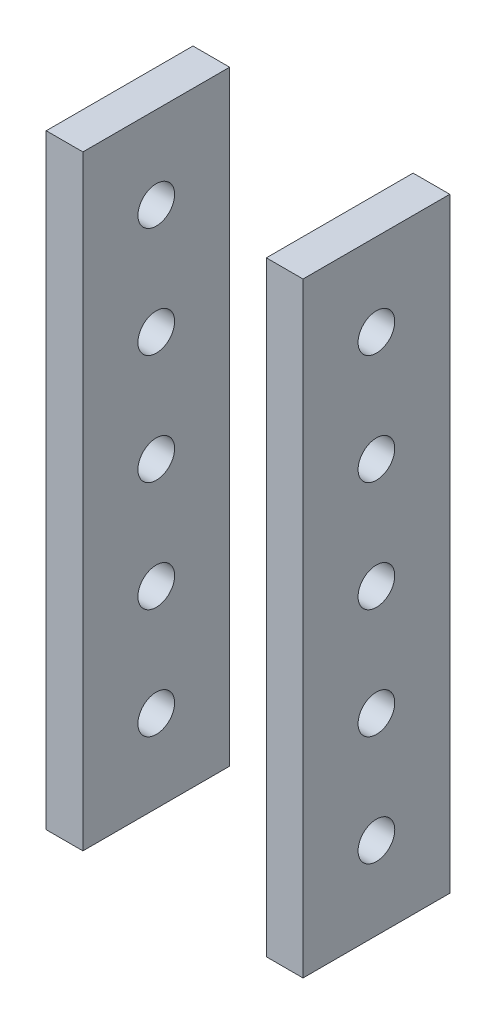
ISO-10303-21;
HEADER;
FILE_DESCRIPTION(('STEP AP214'),'2;1');
FILE_NAME('part.step','',(''),(''),'','','');
FILE_SCHEMA(('AUTOMOTIVE_DESIGN { 1 0 10303 214 1 1 1 1 }'));
ENDSEC;
DATA;
#1=APPLICATION_CONTEXT('core data for automotive mechanical design processes');
#2=APPLICATION_PROTOCOL_DEFINITION('international standard','automotive_design',2000,#1);
#3=PRODUCT_CONTEXT('',#1,'mechanical');
#4=PRODUCT('Part','Part','',(#3));
#5=PRODUCT_RELATED_PRODUCT_CATEGORY('part','',(#4));
#6=PRODUCT_DEFINITION_FORMATION('','',#4);
#7=PRODUCT_DEFINITION_CONTEXT('part definition',#1,'design');
#8=PRODUCT_DEFINITION('design','',#6,#7);
#9=PRODUCT_DEFINITION_SHAPE('','',#8);
#10=(LENGTH_UNIT() NAMED_UNIT(*) SI_UNIT(.MILLI.,.METRE.));
#11=(NAMED_UNIT(*) PLANE_ANGLE_UNIT() SI_UNIT($,.RADIAN.));
#12=(NAMED_UNIT(*) SI_UNIT($,.STERADIAN.) SOLID_ANGLE_UNIT());
#13=UNCERTAINTY_MEASURE_WITH_UNIT(LENGTH_MEASURE(1.E-05),#10,'distance_accuracy_value','');
#14=(GEOMETRIC_REPRESENTATION_CONTEXT(3) GLOBAL_UNCERTAINTY_ASSIGNED_CONTEXT((#13)) GLOBAL_UNIT_ASSIGNED_CONTEXT((#10,
#11,#12)) REPRESENTATION_CONTEXT('',''));
#15=CARTESIAN_POINT('',(0.,0.,0.));
#16=DIRECTION('',(0.,0.,1.));
#17=DIRECTION('',(1.,0.,0.));
#18=AXIS2_PLACEMENT_3D('',#15,#16,#17);
#19=CARTESIAN_POINT('',(35.,0.,0.));
#20=DIRECTION('',(0.,0.,1.));
#21=DIRECTION('',(-1.,0.,0.));
#22=AXIS2_PLACEMENT_3D('',#19,#20,#21);
#23=PLANE('',#22);
#24=DIRECTION('',(0.,-1.,0.));
#25=VECTOR('',#24,1.);
#26=CARTESIAN_POINT('',(25.,0.,0.));
#27=LINE('',#26,#25);
#28=CARTESIAN_POINT('',(25.,-141.649794608489,0.));
#29=VERTEX_POINT('',#28);
#30=CARTESIAN_POINT('',(25.,-306.649794608489,0.));
#31=VERTEX_POINT('',#30);
#32=EDGE_CURVE('E129',#29,#31,#27,.T.);
#33=ORIENTED_EDGE('',*,*,#32,.F.);
#34=DIRECTION('',(-1.,0.,0.));
#35=VECTOR('',#34,1.);
#36=CARTESIAN_POINT('',(35.,-141.649794608489,0.));
#37=LINE('',#36,#35);
#38=CARTESIAN_POINT('',(35.,-141.649794608489,0.));
#39=VERTEX_POINT('',#38);
#40=EDGE_CURVE('E53',#39,#29,#37,.T.);
#41=ORIENTED_EDGE('',*,*,#40,.F.);
#42=DIRECTION('',(0.,-1.,0.));
#43=VECTOR('',#42,1.);
#44=CARTESIAN_POINT('',(35.,0.,0.));
#45=LINE('',#44,#43);
#46=CARTESIAN_POINT('',(35.,-306.649794608489,0.));
#47=VERTEX_POINT('',#46);
#48=EDGE_CURVE('E103',#39,#47,#45,.T.);
#49=ORIENTED_EDGE('',*,*,#48,.T.);
#50=DIRECTION('',(-1.,0.,0.));
#51=VECTOR('',#50,1.);
#52=CARTESIAN_POINT('',(35.,-306.649794608489,0.));
#53=LINE('',#52,#51);
#54=EDGE_CURVE('E12',#47,#31,#53,.T.);
#55=ORIENTED_EDGE('',*,*,#54,.T.);
#56=EDGE_LOOP('',(#33,#41,#49,#55));
#57=FACE_BOUND('',#56,.T.);
#58=ADVANCED_FACE('F49',(#57),#23,.F.);
#59=CARTESIAN_POINT('',(35.,-306.649794608489,4.2556207808865E-13));
#60=DIRECTION('',(0.,-1.,0.));
#61=DIRECTION('',(0.,0.,-1.));
#62=AXIS2_PLACEMENT_3D('',#59,#60,#61);
#63=PLANE('',#62);
#64=DIRECTION('',(0.,0.,-1.));
#65=VECTOR('',#64,1.);
#66=CARTESIAN_POINT('',(25.,-306.649794608489,4.2556207808865E-13));
#67=LINE('',#66,#65);
#68=CARTESIAN_POINT('',(25.,-306.649794608489,40.));
#69=VERTEX_POINT('',#68);
#70=EDGE_CURVE('E91',#69,#31,#67,.T.);
#71=ORIENTED_EDGE('',*,*,#70,.T.);
#72=ORIENTED_EDGE('',*,*,#54,.F.);
#73=DIRECTION('',(0.,0.,-1.));
#74=VECTOR('',#73,1.);
#75=CARTESIAN_POINT('',(35.,-306.649794608489,4.2556207808865E-13));
#76=LINE('',#75,#74);
#77=CARTESIAN_POINT('',(35.,-306.649794608489,40.));
#78=VERTEX_POINT('',#77);
#79=EDGE_CURVE('E68',#78,#47,#76,.T.);
#80=ORIENTED_EDGE('',*,*,#79,.F.);
#81=DIRECTION('',(-1.,0.,0.));
#82=VECTOR('',#81,1.);
#83=CARTESIAN_POINT('',(35.,-306.649794608489,40.));
#84=LINE('',#83,#82);
#85=EDGE_CURVE('E59',#78,#69,#84,.T.);
#86=ORIENTED_EDGE('',*,*,#85,.T.);
#87=EDGE_LOOP('',(#71,#72,#80,#86));
#88=FACE_BOUND('',#87,.T.);
#89=ADVANCED_FACE('F136',(#88),#63,.T.);
#90=CARTESIAN_POINT('',(35.,0.,40.));
#91=DIRECTION('',(0.,0.,-1.));
#92=DIRECTION('',(1.,0.,0.));
#93=AXIS2_PLACEMENT_3D('',#90,#91,#92);
#94=PLANE('',#93);
#95=DIRECTION('',(0.,1.,0.));
#96=VECTOR('',#95,1.);
#97=CARTESIAN_POINT('',(25.,0.,40.));
#98=LINE('',#97,#96);
#99=CARTESIAN_POINT('',(25.,-141.649794608489,40.));
#100=VERTEX_POINT('',#99);
#101=EDGE_CURVE('E85',#69,#100,#98,.T.);
#102=ORIENTED_EDGE('',*,*,#101,.F.);
#103=ORIENTED_EDGE('',*,*,#85,.F.);
#104=DIRECTION('',(0.,1.,0.));
#105=VECTOR('',#104,1.);
#106=CARTESIAN_POINT('',(35.,0.,40.));
#107=LINE('',#106,#105);
#108=CARTESIAN_POINT('',(35.,-141.649794608489,40.));
#109=VERTEX_POINT('',#108);
#110=EDGE_CURVE('E101',#78,#109,#107,.T.);
#111=ORIENTED_EDGE('',*,*,#110,.T.);
#112=DIRECTION('',(-1.,0.,0.));
#113=VECTOR('',#112,1.);
#114=CARTESIAN_POINT('',(35.,-141.649794608489,40.));
#115=LINE('',#114,#113);
#116=EDGE_CURVE('E106',#109,#100,#115,.T.);
#117=ORIENTED_EDGE('',*,*,#116,.T.);
#118=EDGE_LOOP('',(#102,#103,#111,#117));
#119=FACE_BOUND('',#118,.T.);
#120=ADVANCED_FACE('F109',(#119),#94,.F.);
#121=CARTESIAN_POINT('',(35.,-224.149794608489,20.));
#122=DIRECTION('',(-1.,0.,0.));
#123=DIRECTION('',(0.,0.,-1.));
#124=AXIS2_PLACEMENT_3D('',#121,#122,#123);
#125=CYLINDRICAL_SURFACE('',#124,5.00000000000001);
#126=CARTESIAN_POINT('',(35.,-224.149794608489,20.));
#127=DIRECTION('',(1.,0.,0.));
#128=DIRECTION('',(0.,0.,-1.));
#129=AXIS2_PLACEMENT_3D('',#126,#127,#128);
#130=CIRCLE('',#129,5.00000000000001);
#131=CARTESIAN_POINT('',(35.,-224.149794608489,15.));
#132=VERTEX_POINT('',#131);
#133=EDGE_CURVE('E141',#132,#132,#130,.T.);
#134=ORIENTED_EDGE('',*,*,#133,.T.);
#135=EDGE_LOOP('',(#134));
#136=FACE_BOUND('',#135,.T.);
#137=CARTESIAN_POINT('',(25.,-224.149794608489,20.));
#138=DIRECTION('',(1.,0.,0.));
#139=DIRECTION('',(0.,0.,-1.));
#140=AXIS2_PLACEMENT_3D('',#137,#138,#139);
#141=CIRCLE('',#140,5.00000000000001);
#142=CARTESIAN_POINT('',(25.,-224.149794608489,15.));
#143=VERTEX_POINT('',#142);
#144=EDGE_CURVE('E126',#143,#143,#141,.T.);
#145=ORIENTED_EDGE('',*,*,#144,.F.);
#146=EDGE_LOOP('',(#145));
#147=FACE_BOUND('',#146,.T.);
#148=ADVANCED_FACE('F170',(#136,#147),#125,.F.);
#149=CARTESIAN_POINT('',(35.,-194.149794608489,20.));
#150=DIRECTION('',(-1.,0.,0.));
#151=DIRECTION('',(0.,0.,-1.));
#152=AXIS2_PLACEMENT_3D('',#149,#150,#151);
#153=CYLINDRICAL_SURFACE('',#152,5.00000000000001);
#154=CARTESIAN_POINT('',(35.,-194.149794608489,20.));
#155=DIRECTION('',(1.,0.,0.));
#156=DIRECTION('',(0.,0.,-1.));
#157=AXIS2_PLACEMENT_3D('',#154,#155,#156);
#158=CIRCLE('',#157,5.00000000000001);
#159=CARTESIAN_POINT('',(35.,-194.149794608489,15.));
#160=VERTEX_POINT('',#159);
#161=EDGE_CURVE('E143',#160,#160,#158,.T.);
#162=ORIENTED_EDGE('',*,*,#161,.T.);
#163=EDGE_LOOP('',(#162));
#164=FACE_BOUND('',#163,.T.);
#165=CARTESIAN_POINT('',(25.,-194.149794608489,20.));
#166=DIRECTION('',(1.,0.,0.));
#167=DIRECTION('',(0.,0.,-1.));
#168=AXIS2_PLACEMENT_3D('',#165,#166,#167);
#169=CIRCLE('',#168,5.00000000000001);
#170=CARTESIAN_POINT('',(25.,-194.149794608489,15.));
#171=VERTEX_POINT('',#170);
#172=EDGE_CURVE('E123',#171,#171,#169,.T.);
#173=ORIENTED_EDGE('',*,*,#172,.F.);
#174=EDGE_LOOP('',(#173));
#175=FACE_BOUND('',#174,.T.);
#176=ADVANCED_FACE('F173',(#164,#175),#153,.F.);
#177=CARTESIAN_POINT('',(35.,-164.149794608489,20.));
#178=DIRECTION('',(-1.,0.,0.));
#179=DIRECTION('',(0.,0.,-1.));
#180=AXIS2_PLACEMENT_3D('',#177,#178,#179);
#181=CYLINDRICAL_SURFACE('',#180,5.00000000000001);
#182=CARTESIAN_POINT('',(35.,-164.149794608489,20.));
#183=DIRECTION('',(1.,0.,0.));
#184=DIRECTION('',(0.,0.,-1.));
#185=AXIS2_PLACEMENT_3D('',#182,#183,#184);
#186=CIRCLE('',#185,5.00000000000001);
#187=CARTESIAN_POINT('',(35.,-164.149794608489,15.));
#188=VERTEX_POINT('',#187);
#189=EDGE_CURVE('E148',#188,#188,#186,.T.);
#190=ORIENTED_EDGE('',*,*,#189,.T.);
#191=EDGE_LOOP('',(#190));
#192=FACE_BOUND('',#191,.T.);
#193=CARTESIAN_POINT('',(25.,-164.149794608489,20.));
#194=DIRECTION('',(1.,0.,0.));
#195=DIRECTION('',(0.,0.,-1.));
#196=AXIS2_PLACEMENT_3D('',#193,#194,#195);
#197=CIRCLE('',#196,5.00000000000001);
#198=CARTESIAN_POINT('',(25.,-164.149794608489,15.));
#199=VERTEX_POINT('',#198);
#200=EDGE_CURVE('E120',#199,#199,#197,.T.);
#201=ORIENTED_EDGE('',*,*,#200,.F.);
#202=EDGE_LOOP('',(#201));
#203=FACE_BOUND('',#202,.T.);
#204=ADVANCED_FACE('F194',(#192,#203),#181,.F.);
#205=CARTESIAN_POINT('',(35.,-254.149794608489,20.));
#206=DIRECTION('',(-1.,0.,0.));
#207=DIRECTION('',(0.,0.,-1.));
#208=AXIS2_PLACEMENT_3D('',#205,#206,#207);
#209=CYLINDRICAL_SURFACE('',#208,5.00000000000001);
#210=CARTESIAN_POINT('',(35.,-254.149794608489,20.));
#211=DIRECTION('',(1.,0.,0.));
#212=DIRECTION('',(0.,0.,-1.));
#213=AXIS2_PLACEMENT_3D('',#210,#211,#212);
#214=CIRCLE('',#213,5.00000000000001);
#215=CARTESIAN_POINT('',(35.,-254.149794608489,15.));
#216=VERTEX_POINT('',#215);
#217=EDGE_CURVE('E151',#216,#216,#214,.T.);
#218=ORIENTED_EDGE('',*,*,#217,.T.);
#219=EDGE_LOOP('',(#218));
#220=FACE_BOUND('',#219,.T.);
#221=CARTESIAN_POINT('',(25.,-254.149794608489,20.));
#222=DIRECTION('',(1.,0.,0.));
#223=DIRECTION('',(0.,0.,-1.));
#224=AXIS2_PLACEMENT_3D('',#221,#222,#223);
#225=CIRCLE('',#224,5.00000000000001);
#226=CARTESIAN_POINT('',(25.,-254.149794608489,15.));
#227=VERTEX_POINT('',#226);
#228=EDGE_CURVE('E117',#227,#227,#225,.T.);
#229=ORIENTED_EDGE('',*,*,#228,.F.);
#230=EDGE_LOOP('',(#229));
#231=FACE_BOUND('',#230,.T.);
#232=ADVANCED_FACE('F197',(#220,#231),#209,.F.);
#233=CARTESIAN_POINT('',(35.,-284.149794608489,20.));
#234=DIRECTION('',(-1.,0.,0.));
#235=DIRECTION('',(0.,0.,-1.));
#236=AXIS2_PLACEMENT_3D('',#233,#234,#235);
#237=CYLINDRICAL_SURFACE('',#236,5.00000000000001);
#238=CARTESIAN_POINT('',(35.,-284.149794608489,20.));
#239=DIRECTION('',(1.,0.,0.));
#240=DIRECTION('',(0.,0.,-1.));
#241=AXIS2_PLACEMENT_3D('',#238,#239,#240);
#242=CIRCLE('',#241,5.00000000000001);
#243=CARTESIAN_POINT('',(35.,-284.149794608489,15.));
#244=VERTEX_POINT('',#243);
#245=EDGE_CURVE('E134',#244,#244,#242,.T.);
#246=ORIENTED_EDGE('',*,*,#245,.T.);
#247=EDGE_LOOP('',(#246));
#248=FACE_BOUND('',#247,.T.);
#249=CARTESIAN_POINT('',(25.,-284.149794608489,20.));
#250=DIRECTION('',(1.,0.,0.));
#251=DIRECTION('',(0.,0.,-1.));
#252=AXIS2_PLACEMENT_3D('',#249,#250,#251);
#253=CIRCLE('',#252,5.00000000000001);
#254=CARTESIAN_POINT('',(25.,-284.149794608489,15.));
#255=VERTEX_POINT('',#254);
#256=EDGE_CURVE('E114',#255,#255,#253,.T.);
#257=ORIENTED_EDGE('',*,*,#256,.F.);
#258=EDGE_LOOP('',(#257));
#259=FACE_BOUND('',#258,.T.);
#260=ADVANCED_FACE('F51',(#248,#259),#237,.F.);
#261=CARTESIAN_POINT('',(35.,-141.649794608489,0.));
#262=DIRECTION('',(0.,-1.,0.));
#263=DIRECTION('',(0.,0.,-1.));
#264=AXIS2_PLACEMENT_3D('',#261,#262,#263);
#265=PLANE('',#264);
#266=DIRECTION('',(0.,0.,-1.));
#267=VECTOR('',#266,1.);
#268=CARTESIAN_POINT('',(25.,-141.649794608489,0.));
#269=LINE('',#268,#267);
#270=EDGE_CURVE('E108',#100,#29,#269,.T.);
#271=ORIENTED_EDGE('',*,*,#270,.F.);
#272=ORIENTED_EDGE('',*,*,#116,.F.);
#273=DIRECTION('',(0.,0.,-1.));
#274=VECTOR('',#273,1.);
#275=CARTESIAN_POINT('',(35.,-141.649794608489,0.));
#276=LINE('',#275,#274);
#277=EDGE_CURVE('E98',#109,#39,#276,.T.);
#278=ORIENTED_EDGE('',*,*,#277,.T.);
#279=ORIENTED_EDGE('',*,*,#40,.T.);
#280=EDGE_LOOP('',(#271,#272,#278,#279));
#281=FACE_BOUND('',#280,.T.);
#282=ADVANCED_FACE('F107',(#281),#265,.F.);
#283=CARTESIAN_POINT('',(35.,0.,0.));
#284=DIRECTION('',(-1.,0.,0.));
#285=DIRECTION('',(0.,0.,-1.));
#286=AXIS2_PLACEMENT_3D('',#283,#284,#285);
#287=PLANE('',#286);
#288=ORIENTED_EDGE('',*,*,#245,.F.);
#289=EDGE_LOOP('',(#288));
#290=FACE_BOUND('',#289,.T.);
#291=ORIENTED_EDGE('',*,*,#217,.F.);
#292=EDGE_LOOP('',(#291));
#293=FACE_BOUND('',#292,.T.);
#294=ORIENTED_EDGE('',*,*,#189,.F.);
#295=EDGE_LOOP('',(#294));
#296=FACE_BOUND('',#295,.T.);
#297=ORIENTED_EDGE('',*,*,#161,.F.);
#298=EDGE_LOOP('',(#297));
#299=FACE_BOUND('',#298,.T.);
#300=ORIENTED_EDGE('',*,*,#133,.F.);
#301=EDGE_LOOP('',(#300));
#302=FACE_BOUND('',#301,.T.);
#303=ORIENTED_EDGE('',*,*,#48,.F.);
#304=ORIENTED_EDGE('',*,*,#277,.F.);
#305=ORIENTED_EDGE('',*,*,#110,.F.);
#306=ORIENTED_EDGE('',*,*,#79,.T.);
#307=EDGE_LOOP('',(#303,#304,#305,#306));
#308=FACE_BOUND('',#307,.T.);
#309=ADVANCED_FACE('F99',(#290,#293,#296,#299,#302,#308),#287,.F.);
#310=CARTESIAN_POINT('',(25.,0.,0.));
#311=DIRECTION('',(-1.,0.,0.));
#312=DIRECTION('',(0.,0.,-1.));
#313=AXIS2_PLACEMENT_3D('',#310,#311,#312);
#314=PLANE('',#313);
#315=ORIENTED_EDGE('',*,*,#256,.T.);
#316=EDGE_LOOP('',(#315));
#317=FACE_BOUND('',#316,.T.);
#318=ORIENTED_EDGE('',*,*,#228,.T.);
#319=EDGE_LOOP('',(#318));
#320=FACE_BOUND('',#319,.T.);
#321=ORIENTED_EDGE('',*,*,#200,.T.);
#322=EDGE_LOOP('',(#321));
#323=FACE_BOUND('',#322,.T.);
#324=ORIENTED_EDGE('',*,*,#172,.T.);
#325=EDGE_LOOP('',(#324));
#326=FACE_BOUND('',#325,.T.);
#327=ORIENTED_EDGE('',*,*,#144,.T.);
#328=EDGE_LOOP('',(#327));
#329=FACE_BOUND('',#328,.T.);
#330=ORIENTED_EDGE('',*,*,#32,.T.);
#331=ORIENTED_EDGE('',*,*,#70,.F.);
#332=ORIENTED_EDGE('',*,*,#101,.T.);
#333=ORIENTED_EDGE('',*,*,#270,.T.);
#334=EDGE_LOOP('',(#330,#331,#332,#333));
#335=FACE_BOUND('',#334,.T.);
#336=ADVANCED_FACE('F138',(#317,#320,#323,#326,#329,#335),#314,.T.);
#337=CLOSED_SHELL('',(#58,#89,#120,#148,#176,#204,#232,#260,#282,#309,#336));
#338=MANIFOLD_SOLID_BREP('B2',#337);
#339=CARTESIAN_POINT('',(-35.,0.,0.));
#340=DIRECTION('',(0.,0.,1.));
#341=DIRECTION('',(1.,0.,0.));
#342=AXIS2_PLACEMENT_3D('',#339,#340,#341);
#343=PLANE('',#342);
#344=DIRECTION('',(0.,-1.,0.));
#345=VECTOR('',#344,1.);
#346=CARTESIAN_POINT('',(-25.,0.,0.));
#347=LINE('',#346,#345);
#348=CARTESIAN_POINT('',(-25.,-141.649794608489,0.));
#349=VERTEX_POINT('',#348);
#350=CARTESIAN_POINT('',(-25.,-306.649794608489,0.));
#351=VERTEX_POINT('',#350);
#352=EDGE_CURVE('E389',#349,#351,#347,.T.);
#353=ORIENTED_EDGE('',*,*,#352,.T.);
#354=DIRECTION('',(1.,0.,0.));
#355=VECTOR('',#354,1.);
#356=CARTESIAN_POINT('',(-35.,-306.649794608489,0.));
#357=LINE('',#356,#355);
#358=CARTESIAN_POINT('',(-35.,-306.649794608489,0.));
#359=VERTEX_POINT('',#358);
#360=EDGE_CURVE('E47',#359,#351,#357,.T.);
#361=ORIENTED_EDGE('',*,*,#360,.F.);
#362=DIRECTION('',(0.,-1.,0.));
#363=VECTOR('',#362,1.);
#364=CARTESIAN_POINT('',(-35.,0.,0.));
#365=LINE('',#364,#363);
#366=CARTESIAN_POINT('',(-35.,-141.649794608489,0.));
#367=VERTEX_POINT('',#366);
#368=EDGE_CURVE('E328',#367,#359,#365,.T.);
#369=ORIENTED_EDGE('',*,*,#368,.F.);
#370=DIRECTION('',(1.,0.,0.));
#371=VECTOR('',#370,1.);
#372=CARTESIAN_POINT('',(-35.,-141.649794608489,0.));
#373=LINE('',#372,#371);
#374=EDGE_CURVE('E313',#367,#349,#373,.T.);
#375=ORIENTED_EDGE('',*,*,#374,.T.);
#376=EDGE_LOOP('',(#353,#361,#369,#375));
#377=FACE_BOUND('',#376,.T.);
#378=ADVANCED_FACE('F309',(#377),#343,.F.);
#379=CARTESIAN_POINT('',(-35.,-306.649794608489,4.2556207808865E-13));
#380=DIRECTION('',(0.,-1.,0.));
#381=DIRECTION('',(0.,0.,-1.));
#382=AXIS2_PLACEMENT_3D('',#379,#380,#381);
#383=PLANE('',#382);
#384=DIRECTION('',(0.,0.,-1.));
#385=VECTOR('',#384,1.);
#386=CARTESIAN_POINT('',(-25.,-306.649794608489,4.2556207808865E-13));
#387=LINE('',#386,#385);
#388=CARTESIAN_POINT('',(-25.,-306.649794608489,40.));
#389=VERTEX_POINT('',#388);
#390=EDGE_CURVE('E394',#389,#351,#387,.T.);
#391=ORIENTED_EDGE('',*,*,#390,.F.);
#392=DIRECTION('',(1.,0.,0.));
#393=VECTOR('',#392,1.);
#394=CARTESIAN_POINT('',(-35.,-306.649794608489,40.));
#395=LINE('',#394,#393);
#396=CARTESIAN_POINT('',(-35.,-306.649794608489,40.));
#397=VERTEX_POINT('',#396);
#398=EDGE_CURVE('E319',#397,#389,#395,.T.);
#399=ORIENTED_EDGE('',*,*,#398,.F.);
#400=DIRECTION('',(0.,0.,-1.));
#401=VECTOR('',#400,1.);
#402=CARTESIAN_POINT('',(-35.,-306.649794608489,4.2556207808865E-13));
#403=LINE('',#402,#401);
#404=EDGE_CURVE('E358',#397,#359,#403,.T.);
#405=ORIENTED_EDGE('',*,*,#404,.T.);
#406=ORIENTED_EDGE('',*,*,#360,.T.);
#407=EDGE_LOOP('',(#391,#399,#405,#406));
#408=FACE_BOUND('',#407,.T.);
#409=ADVANCED_FACE('F429',(#408),#383,.T.);
#410=CARTESIAN_POINT('',(-35.,0.,40.));
#411=DIRECTION('',(0.,0.,-1.));
#412=DIRECTION('',(-1.,0.,0.));
#413=AXIS2_PLACEMENT_3D('',#410,#411,#412);
#414=PLANE('',#413);
#415=DIRECTION('',(0.,1.,0.));
#416=VECTOR('',#415,1.);
#417=CARTESIAN_POINT('',(-25.,0.,40.));
#418=LINE('',#417,#416);
#419=CARTESIAN_POINT('',(-25.,-141.649794608489,40.));
#420=VERTEX_POINT('',#419);
#421=EDGE_CURVE('E363',#389,#420,#418,.T.);
#422=ORIENTED_EDGE('',*,*,#421,.T.);
#423=DIRECTION('',(1.,0.,0.));
#424=VECTOR('',#423,1.);
#425=CARTESIAN_POINT('',(-35.,-141.649794608489,40.));
#426=LINE('',#425,#424);
#427=CARTESIAN_POINT('',(-35.,-141.649794608489,40.));
#428=VERTEX_POINT('',#427);
#429=EDGE_CURVE('E361',#428,#420,#426,.T.);
#430=ORIENTED_EDGE('',*,*,#429,.F.);
#431=DIRECTION('',(0.,1.,0.));
#432=VECTOR('',#431,1.);
#433=CARTESIAN_POINT('',(-35.,0.,40.));
#434=LINE('',#433,#432);
#435=EDGE_CURVE('E355',#397,#428,#434,.T.);
#436=ORIENTED_EDGE('',*,*,#435,.F.);
#437=ORIENTED_EDGE('',*,*,#398,.T.);
#438=EDGE_LOOP('',(#422,#430,#436,#437));
#439=FACE_BOUND('',#438,.T.);
#440=ADVANCED_FACE('F362',(#439),#414,.F.);
#441=CARTESIAN_POINT('',(-35.,-224.149794608489,20.));
#442=DIRECTION('',(1.,0.,0.));
#443=DIRECTION('',(0.,0.,-1.));
#444=AXIS2_PLACEMENT_3D('',#441,#442,#443);
#445=CYLINDRICAL_SURFACE('',#444,5.00000000000001);
#446=CARTESIAN_POINT('',(-35.,-224.149794608489,20.));
#447=DIRECTION('',(1.,0.,0.));
#448=DIRECTION('',(0.,0.,-1.));
#449=AXIS2_PLACEMENT_3D('',#446,#447,#448);
#450=CIRCLE('',#449,5.00000000000001);
#451=CARTESIAN_POINT('',(-35.,-224.149794608489,15.));
#452=VERTEX_POINT('',#451);
#453=EDGE_CURVE('E369',#452,#452,#450,.T.);
#454=ORIENTED_EDGE('',*,*,#453,.F.);
#455=EDGE_LOOP('',(#454));
#456=FACE_BOUND('',#455,.T.);
#457=CARTESIAN_POINT('',(-25.,-224.149794608489,20.));
#458=DIRECTION('',(1.,0.,0.));
#459=DIRECTION('',(0.,0.,-1.));
#460=AXIS2_PLACEMENT_3D('',#457,#458,#459);
#461=CIRCLE('',#460,5.00000000000001);
#462=CARTESIAN_POINT('',(-25.,-224.149794608489,15.));
#463=VERTEX_POINT('',#462);
#464=EDGE_CURVE('E386',#463,#463,#461,.T.);
#465=ORIENTED_EDGE('',*,*,#464,.T.);
#466=EDGE_LOOP('',(#465));
#467=FACE_BOUND('',#466,.T.);
#468=ADVANCED_FACE('F417',(#456,#467),#445,.F.);
#469=CARTESIAN_POINT('',(-35.,-194.149794608489,20.));
#470=DIRECTION('',(1.,0.,0.));
#471=DIRECTION('',(0.,0.,-1.));
#472=AXIS2_PLACEMENT_3D('',#469,#470,#471);
#473=CYLINDRICAL_SURFACE('',#472,5.00000000000001);
#474=CARTESIAN_POINT('',(-35.,-194.149794608489,20.));
#475=DIRECTION('',(1.,0.,0.));
#476=DIRECTION('',(0.,0.,-1.));
#477=AXIS2_PLACEMENT_3D('',#474,#475,#476);
#478=CIRCLE('',#477,5.00000000000001);
#479=CARTESIAN_POINT('',(-35.,-194.149794608489,15.));
#480=VERTEX_POINT('',#479);
#481=EDGE_CURVE('E411',#480,#480,#478,.T.);
#482=ORIENTED_EDGE('',*,*,#481,.F.);
#483=EDGE_LOOP('',(#482));
#484=FACE_BOUND('',#483,.T.);
#485=CARTESIAN_POINT('',(-25.,-194.149794608489,20.));
#486=DIRECTION('',(1.,0.,0.));
#487=DIRECTION('',(0.,0.,-1.));
#488=AXIS2_PLACEMENT_3D('',#485,#486,#487);
#489=CIRCLE('',#488,5.00000000000001);
#490=CARTESIAN_POINT('',(-25.,-194.149794608489,15.));
#491=VERTEX_POINT('',#490);
#492=EDGE_CURVE('E383',#491,#491,#489,.T.);
#493=ORIENTED_EDGE('',*,*,#492,.T.);
#494=EDGE_LOOP('',(#493));
#495=FACE_BOUND('',#494,.T.);
#496=ADVANCED_FACE('F420',(#484,#495),#473,.F.);
#497=CARTESIAN_POINT('',(-35.,-164.149794608489,20.));
#498=DIRECTION('',(1.,0.,0.));
#499=DIRECTION('',(0.,0.,-1.));
#500=AXIS2_PLACEMENT_3D('',#497,#498,#499);
#501=CYLINDRICAL_SURFACE('',#500,5.00000000000001);
#502=CARTESIAN_POINT('',(-35.,-164.149794608489,20.));
#503=DIRECTION('',(1.,0.,0.));
#504=DIRECTION('',(0.,0.,-1.));
#505=AXIS2_PLACEMENT_3D('',#502,#503,#504);
#506=CIRCLE('',#505,5.00000000000001);
#507=CARTESIAN_POINT('',(-35.,-164.149794608489,15.));
#508=VERTEX_POINT('',#507);
#509=EDGE_CURVE('E406',#508,#508,#506,.T.);
#510=ORIENTED_EDGE('',*,*,#509,.F.);
#511=EDGE_LOOP('',(#510));
#512=FACE_BOUND('',#511,.T.);
#513=CARTESIAN_POINT('',(-25.,-164.149794608489,20.));
#514=DIRECTION('',(1.,0.,0.));
#515=DIRECTION('',(0.,0.,-1.));
#516=AXIS2_PLACEMENT_3D('',#513,#514,#515);
#517=CIRCLE('',#516,5.00000000000001);
#518=CARTESIAN_POINT('',(-25.,-164.149794608489,15.));
#519=VERTEX_POINT('',#518);
#520=EDGE_CURVE('E380',#519,#519,#517,.T.);
#521=ORIENTED_EDGE('',*,*,#520,.T.);
#522=EDGE_LOOP('',(#521));
#523=FACE_BOUND('',#522,.T.);
#524=ADVANCED_FACE('F444',(#512,#523),#501,.F.);
#525=CARTESIAN_POINT('',(-35.,-254.149794608489,20.));
#526=DIRECTION('',(1.,0.,0.));
#527=DIRECTION('',(0.,0.,-1.));
#528=AXIS2_PLACEMENT_3D('',#525,#526,#527);
#529=CYLINDRICAL_SURFACE('',#528,5.00000000000001);
#530=CARTESIAN_POINT('',(-35.,-254.149794608489,20.));
#531=DIRECTION('',(1.,0.,0.));
#532=DIRECTION('',(0.,0.,-1.));
#533=AXIS2_PLACEMENT_3D('',#530,#531,#532);
#534=CIRCLE('',#533,5.00000000000001);
#535=CARTESIAN_POINT('',(-35.,-254.149794608489,15.));
#536=VERTEX_POINT('',#535);
#537=EDGE_CURVE('E401',#536,#536,#534,.T.);
#538=ORIENTED_EDGE('',*,*,#537,.F.);
#539=EDGE_LOOP('',(#538));
#540=FACE_BOUND('',#539,.T.);
#541=CARTESIAN_POINT('',(-25.,-254.149794608489,20.));
#542=DIRECTION('',(1.,0.,0.));
#543=DIRECTION('',(0.,0.,-1.));
#544=AXIS2_PLACEMENT_3D('',#541,#542,#543);
#545=CIRCLE('',#544,5.00000000000001);
#546=CARTESIAN_POINT('',(-25.,-254.149794608489,15.));
#547=VERTEX_POINT('',#546);
#548=EDGE_CURVE('E377',#547,#547,#545,.T.);
#549=ORIENTED_EDGE('',*,*,#548,.T.);
#550=EDGE_LOOP('',(#549));
#551=FACE_BOUND('',#550,.T.);
#552=ADVANCED_FACE('F447',(#540,#551),#529,.F.);
#553=CARTESIAN_POINT('',(-35.,-284.149794608489,20.));
#554=DIRECTION('',(1.,0.,0.));
#555=DIRECTION('',(0.,0.,-1.));
#556=AXIS2_PLACEMENT_3D('',#553,#554,#555);
#557=CYLINDRICAL_SURFACE('',#556,5.00000000000001);
#558=CARTESIAN_POINT('',(-35.,-284.149794608489,20.));
#559=DIRECTION('',(1.,0.,0.));
#560=DIRECTION('',(0.,0.,-1.));
#561=AXIS2_PLACEMENT_3D('',#558,#559,#560);
#562=CIRCLE('',#561,5.00000000000001);
#563=CARTESIAN_POINT('',(-35.,-284.149794608489,15.));
#564=VERTEX_POINT('',#563);
#565=EDGE_CURVE('E396',#564,#564,#562,.T.);
#566=ORIENTED_EDGE('',*,*,#565,.F.);
#567=EDGE_LOOP('',(#566));
#568=FACE_BOUND('',#567,.T.);
#569=CARTESIAN_POINT('',(-25.,-284.149794608489,20.));
#570=DIRECTION('',(1.,0.,0.));
#571=DIRECTION('',(0.,0.,-1.));
#572=AXIS2_PLACEMENT_3D('',#569,#570,#571);
#573=CIRCLE('',#572,5.00000000000001);
#574=CARTESIAN_POINT('',(-25.,-284.149794608489,15.));
#575=VERTEX_POINT('',#574);
#576=EDGE_CURVE('E374',#575,#575,#573,.T.);
#577=ORIENTED_EDGE('',*,*,#576,.T.);
#578=EDGE_LOOP('',(#577));
#579=FACE_BOUND('',#578,.T.);
#580=ADVANCED_FACE('F311',(#568,#579),#557,.F.);
#581=CARTESIAN_POINT('',(-35.,-141.649794608489,0.));
#582=DIRECTION('',(0.,-1.,0.));
#583=DIRECTION('',(0.,0.,-1.));
#584=AXIS2_PLACEMENT_3D('',#581,#582,#583);
#585=PLANE('',#584);
#586=DIRECTION('',(0.,0.,-1.));
#587=VECTOR('',#586,1.);
#588=CARTESIAN_POINT('',(-25.,-141.649794608489,0.));
#589=LINE('',#588,#587);
#590=EDGE_CURVE('E391',#420,#349,#589,.T.);
#591=ORIENTED_EDGE('',*,*,#590,.T.);
#592=ORIENTED_EDGE('',*,*,#374,.F.);
#593=DIRECTION('',(0.,0.,-1.));
#594=VECTOR('',#593,1.);
#595=CARTESIAN_POINT('',(-35.,-141.649794608489,0.));
#596=LINE('',#595,#594);
#597=EDGE_CURVE('E353',#428,#367,#596,.T.);
#598=ORIENTED_EDGE('',*,*,#597,.F.);
#599=ORIENTED_EDGE('',*,*,#429,.T.);
#600=EDGE_LOOP('',(#591,#592,#598,#599));
#601=FACE_BOUND('',#600,.T.);
#602=ADVANCED_FACE('F366',(#601),#585,.F.);
#603=CARTESIAN_POINT('',(-35.,0.,0.));
#604=DIRECTION('',(1.,0.,0.));
#605=DIRECTION('',(0.,0.,-1.));
#606=AXIS2_PLACEMENT_3D('',#603,#604,#605);
#607=PLANE('',#606);
#608=ORIENTED_EDGE('',*,*,#565,.T.);
#609=EDGE_LOOP('',(#608));
#610=FACE_BOUND('',#609,.T.);
#611=ORIENTED_EDGE('',*,*,#537,.T.);
#612=EDGE_LOOP('',(#611));
#613=FACE_BOUND('',#612,.T.);
#614=ORIENTED_EDGE('',*,*,#509,.T.);
#615=EDGE_LOOP('',(#614));
#616=FACE_BOUND('',#615,.T.);
#617=ORIENTED_EDGE('',*,*,#481,.T.);
#618=EDGE_LOOP('',(#617));
#619=FACE_BOUND('',#618,.T.);
#620=ORIENTED_EDGE('',*,*,#453,.T.);
#621=EDGE_LOOP('',(#620));
#622=FACE_BOUND('',#621,.T.);
#623=ORIENTED_EDGE('',*,*,#368,.T.);
#624=ORIENTED_EDGE('',*,*,#404,.F.);
#625=ORIENTED_EDGE('',*,*,#435,.T.);
#626=ORIENTED_EDGE('',*,*,#597,.T.);
#627=EDGE_LOOP('',(#623,#624,#625,#626));
#628=FACE_BOUND('',#627,.T.);
#629=ADVANCED_FACE('F357',(#610,#613,#616,#619,#622,#628),#607,.F.);
#630=CARTESIAN_POINT('',(-25.,0.,0.));
#631=DIRECTION('',(1.,0.,0.));
#632=DIRECTION('',(0.,0.,-1.));
#633=AXIS2_PLACEMENT_3D('',#630,#631,#632);
#634=PLANE('',#633);
#635=ORIENTED_EDGE('',*,*,#576,.F.);
#636=EDGE_LOOP('',(#635));
#637=FACE_BOUND('',#636,.T.);
#638=ORIENTED_EDGE('',*,*,#548,.F.);
#639=EDGE_LOOP('',(#638));
#640=FACE_BOUND('',#639,.T.);
#641=ORIENTED_EDGE('',*,*,#520,.F.);
#642=EDGE_LOOP('',(#641));
#643=FACE_BOUND('',#642,.T.);
#644=ORIENTED_EDGE('',*,*,#492,.F.);
#645=EDGE_LOOP('',(#644));
#646=FACE_BOUND('',#645,.T.);
#647=ORIENTED_EDGE('',*,*,#464,.F.);
#648=EDGE_LOOP('',(#647));
#649=FACE_BOUND('',#648,.T.);
#650=ORIENTED_EDGE('',*,*,#352,.F.);
#651=ORIENTED_EDGE('',*,*,#590,.F.);
#652=ORIENTED_EDGE('',*,*,#421,.F.);
#653=ORIENTED_EDGE('',*,*,#390,.T.);
#654=EDGE_LOOP('',(#650,#651,#652,#653));
#655=FACE_BOUND('',#654,.T.);
#656=ADVANCED_FACE('F424',(#637,#640,#643,#646,#649,#655),#634,.T.);
#657=CLOSED_SHELL('',(#378,#409,#440,#468,#496,#524,#552,#580,#602,#629,#656));
#658=MANIFOLD_SOLID_BREP('B6',#657);
#659=ADVANCED_BREP_SHAPE_REPRESENTATION('',(#18,#338,#658),#14);
#660=SHAPE_DEFINITION_REPRESENTATION(#9,#659);
ENDSEC;
END-ISO-10303-21;
